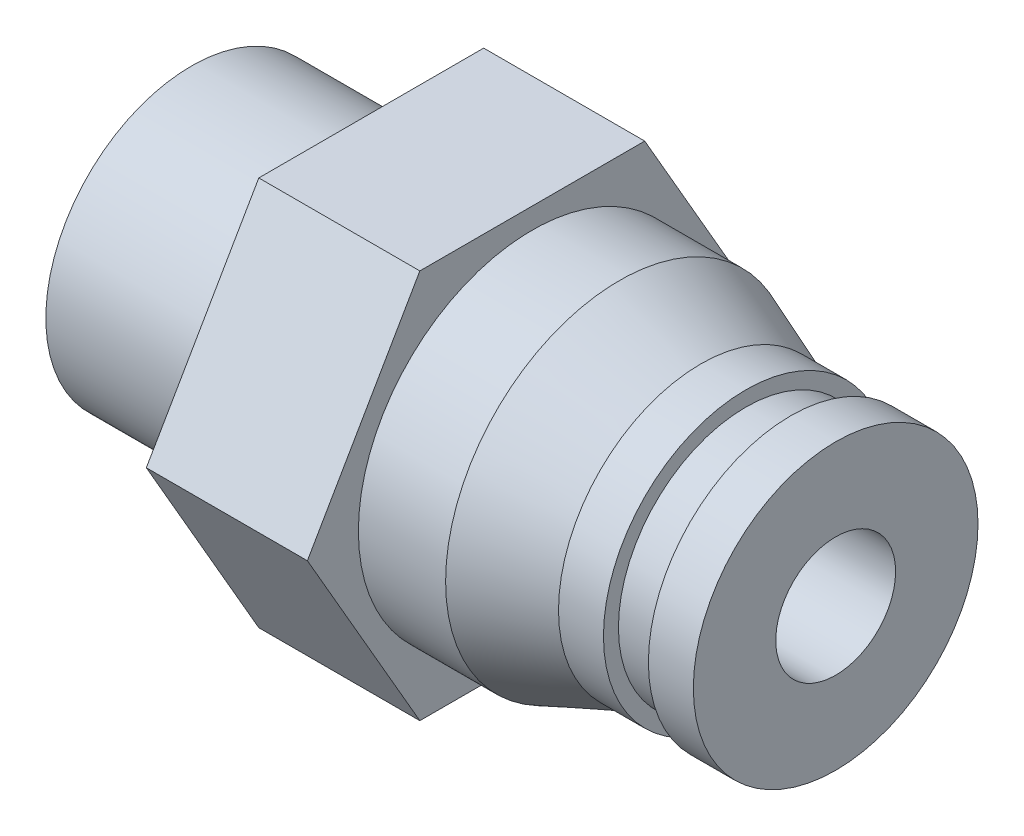
ISO-10303-21;
HEADER;
FILE_DESCRIPTION(('STEP AP214'),'2;1');
FILE_NAME('part.step','',(''),(''),'','','');
FILE_SCHEMA(('AUTOMOTIVE_DESIGN { 1 0 10303 214 1 1 1 1 }'));
ENDSEC;
DATA;
#1=APPLICATION_CONTEXT('core data for automotive mechanical design processes');
#2=APPLICATION_PROTOCOL_DEFINITION('international standard','automotive_design',2000,#1);
#3=PRODUCT_CONTEXT('',#1,'mechanical');
#4=PRODUCT('Part','Part','',(#3));
#5=PRODUCT_RELATED_PRODUCT_CATEGORY('part','',(#4));
#6=PRODUCT_DEFINITION_FORMATION('','',#4);
#7=PRODUCT_DEFINITION_CONTEXT('part definition',#1,'design');
#8=PRODUCT_DEFINITION('design','',#6,#7);
#9=PRODUCT_DEFINITION_SHAPE('','',#8);
#10=(LENGTH_UNIT() NAMED_UNIT(*) SI_UNIT(.MILLI.,.METRE.));
#11=(NAMED_UNIT(*) PLANE_ANGLE_UNIT() SI_UNIT($,.RADIAN.));
#12=(NAMED_UNIT(*) SI_UNIT($,.STERADIAN.) SOLID_ANGLE_UNIT());
#13=UNCERTAINTY_MEASURE_WITH_UNIT(LENGTH_MEASURE(1.E-05),#10,'distance_accuracy_value','');
#14=(GEOMETRIC_REPRESENTATION_CONTEXT(3) GLOBAL_UNCERTAINTY_ASSIGNED_CONTEXT((#13)) GLOBAL_UNIT_ASSIGNED_CONTEXT((#10,
#11,#12)) REPRESENTATION_CONTEXT('',''));
#15=CARTESIAN_POINT('',(0.,0.,0.));
#16=DIRECTION('',(0.,0.,1.));
#17=DIRECTION('',(1.,0.,0.));
#18=AXIS2_PLACEMENT_3D('',#15,#16,#17);
#19=CARTESIAN_POINT('',(6.,4.86,0.));
#20=DIRECTION('',(-1.,0.,0.));
#21=DIRECTION('',(0.,0.,1.));
#22=AXIS2_PLACEMENT_3D('',#19,#20,#21);
#23=PLANE('',#22);
#24=CARTESIAN_POINT('',(6.,0.,0.));
#25=DIRECTION('',(1.,0.,0.));
#26=DIRECTION('',(0.,0.,-1.));
#27=AXIS2_PLACEMENT_3D('',#24,#25,#26);
#28=CIRCLE('',#27,4.86);
#29=CARTESIAN_POINT('',(6.,0.,-4.86));
#30=VERTEX_POINT('',#29);
#31=EDGE_CURVE('E216',#30,#30,#28,.T.);
#32=ORIENTED_EDGE('',*,*,#31,.T.);
#33=EDGE_LOOP('',(#32));
#34=FACE_BOUND('',#33,.T.);
#35=DIRECTION('',(0.,-0.866025403784439,0.5));
#36=VECTOR('',#35,1.);
#37=CARTESIAN_POINT('',(6.,0.,-7.50555349946514));
#38=LINE('',#37,#36);
#39=CARTESIAN_POINT('',(6.,0.,-7.50555349946514));
#40=VERTEX_POINT('',#39);
#41=CARTESIAN_POINT('',(6.,-6.5,-3.75277674973257));
#42=VERTEX_POINT('',#41);
#43=EDGE_CURVE('E122',#40,#42,#38,.T.);
#44=ORIENTED_EDGE('',*,*,#43,.T.);
#45=DIRECTION('',(0.,0.,1.));
#46=VECTOR('',#45,1.);
#47=CARTESIAN_POINT('',(6.,-6.5,-3.75277674973257));
#48=LINE('',#47,#46);
#49=CARTESIAN_POINT('',(6.,-6.5,3.75277674973257));
#50=VERTEX_POINT('',#49);
#51=EDGE_CURVE('E107',#42,#50,#48,.T.);
#52=ORIENTED_EDGE('',*,*,#51,.T.);
#53=DIRECTION('',(0.,0.866025403784439,0.5));
#54=VECTOR('',#53,1.);
#55=CARTESIAN_POINT('',(6.,-6.5,3.75277674973257));
#56=LINE('',#55,#54);
#57=CARTESIAN_POINT('',(6.,0.,7.50555349946513));
#58=VERTEX_POINT('',#57);
#59=EDGE_CURVE('E116',#50,#58,#56,.T.);
#60=ORIENTED_EDGE('',*,*,#59,.T.);
#61=DIRECTION('',(0.,0.866025403784438,-0.5));
#62=VECTOR('',#61,1.);
#63=CARTESIAN_POINT('',(6.,0.,7.50555349946513));
#64=LINE('',#63,#62);
#65=CARTESIAN_POINT('',(6.,6.5,3.75277674973257));
#66=VERTEX_POINT('',#65);
#67=EDGE_CURVE('E31',#58,#66,#64,.T.);
#68=ORIENTED_EDGE('',*,*,#67,.T.);
#69=DIRECTION('',(0.,0.,-1.));
#70=VECTOR('',#69,1.);
#71=CARTESIAN_POINT('',(6.,6.5,3.75277674973257));
#72=LINE('',#71,#70);
#73=CARTESIAN_POINT('',(6.,6.5,-3.75277674973257));
#74=VERTEX_POINT('',#73);
#75=EDGE_CURVE('E126',#66,#74,#72,.T.);
#76=ORIENTED_EDGE('',*,*,#75,.T.);
#77=DIRECTION('',(0.,-0.866025403784439,-0.5));
#78=VECTOR('',#77,1.);
#79=CARTESIAN_POINT('',(6.,6.5,-3.75277674973257));
#80=LINE('',#79,#78);
#81=EDGE_CURVE('E129',#74,#40,#80,.T.);
#82=ORIENTED_EDGE('',*,*,#81,.T.);
#83=EDGE_LOOP('',(#44,#52,#60,#68,#76,#82));
#84=FACE_BOUND('',#83,.T.);
#85=ADVANCED_FACE('F16',(#34,#84),#23,.T.);
#86=CARTESIAN_POINT('',(11.375,8.5,0.));
#87=DIRECTION('',(1.,0.,0.));
#88=DIRECTION('',(0.,0.,-1.));
#89=AXIS2_PLACEMENT_3D('',#86,#87,#88);
#90=PLANE('',#89);
#91=CARTESIAN_POINT('',(11.375,0.,0.));
#92=DIRECTION('',(1.,0.,0.));
#93=DIRECTION('',(0.,0.,-1.));
#94=AXIS2_PLACEMENT_3D('',#91,#92,#93);
#95=CIRCLE('',#94,5.80412866912143);
#96=CARTESIAN_POINT('',(11.375,0.,-5.80412866912143));
#97=VERTEX_POINT('',#96);
#98=EDGE_CURVE('E213',#97,#97,#95,.T.);
#99=ORIENTED_EDGE('',*,*,#98,.F.);
#100=EDGE_LOOP('',(#99));
#101=FACE_BOUND('',#100,.T.);
#102=DIRECTION('',(0.,0.866025403784439,0.5));
#103=VECTOR('',#102,1.);
#104=CARTESIAN_POINT('',(11.375,-6.5,3.75277674973257));
#105=LINE('',#104,#103);
#106=CARTESIAN_POINT('',(11.375,-6.5,3.75277674973257));
#107=VERTEX_POINT('',#106);
#108=CARTESIAN_POINT('',(11.375,0.,7.50555349946513));
#109=VERTEX_POINT('',#108);
#110=EDGE_CURVE('E133',#107,#109,#105,.T.);
#111=ORIENTED_EDGE('',*,*,#110,.F.);
#112=DIRECTION('',(0.,0.,1.));
#113=VECTOR('',#112,1.);
#114=CARTESIAN_POINT('',(11.375,-6.5,-3.75277674973257));
#115=LINE('',#114,#113);
#116=CARTESIAN_POINT('',(11.375,-6.5,-3.75277674973257));
#117=VERTEX_POINT('',#116);
#118=EDGE_CURVE('E39',#117,#107,#115,.T.);
#119=ORIENTED_EDGE('',*,*,#118,.F.);
#120=DIRECTION('',(0.,-0.866025403784439,0.5));
#121=VECTOR('',#120,1.);
#122=CARTESIAN_POINT('',(11.375,0.,-7.50555349946514));
#123=LINE('',#122,#121);
#124=CARTESIAN_POINT('',(11.375,0.,-7.50555349946514));
#125=VERTEX_POINT('',#124);
#126=EDGE_CURVE('E113',#125,#117,#123,.T.);
#127=ORIENTED_EDGE('',*,*,#126,.F.);
#128=DIRECTION('',(0.,-0.866025403784439,-0.5));
#129=VECTOR('',#128,1.);
#130=CARTESIAN_POINT('',(11.375,6.5,-3.75277674973257));
#131=LINE('',#130,#129);
#132=CARTESIAN_POINT('',(11.375,6.5,-3.75277674973257));
#133=VERTEX_POINT('',#132);
#134=EDGE_CURVE('E141',#133,#125,#131,.T.);
#135=ORIENTED_EDGE('',*,*,#134,.F.);
#136=DIRECTION('',(0.,0.,-1.));
#137=VECTOR('',#136,1.);
#138=CARTESIAN_POINT('',(11.375,6.5,3.75277674973257));
#139=LINE('',#138,#137);
#140=CARTESIAN_POINT('',(11.375,6.5,3.75277674973257));
#141=VERTEX_POINT('',#140);
#142=EDGE_CURVE('E138',#141,#133,#139,.T.);
#143=ORIENTED_EDGE('',*,*,#142,.F.);
#144=DIRECTION('',(0.,0.866025403784438,-0.5));
#145=VECTOR('',#144,1.);
#146=CARTESIAN_POINT('',(11.375,0.,7.50555349946513));
#147=LINE('',#146,#145);
#148=EDGE_CURVE('E135',#109,#141,#147,.T.);
#149=ORIENTED_EDGE('',*,*,#148,.F.);
#150=EDGE_LOOP('',(#111,#119,#127,#135,#143,#149));
#151=FACE_BOUND('',#150,.T.);
#152=ADVANCED_FACE('F270',(#101,#151),#90,.T.);
#153=CARTESIAN_POINT('',(0.,0.,0.));
#154=DIRECTION('',(-1.,0.,0.));
#155=DIRECTION('',(0.,0.,1.));
#156=AXIS2_PLACEMENT_3D('',#153,#154,#155);
#157=PLANE('',#156);
#158=CARTESIAN_POINT('',(0.,0.,0.));
#159=DIRECTION('',(1.,0.,0.));
#160=DIRECTION('',(0.,0.,-1.));
#161=AXIS2_PLACEMENT_3D('',#158,#159,#160);
#162=CIRCLE('',#161,4.86);
#163=CARTESIAN_POINT('',(0.,0.,-4.86));
#164=VERTEX_POINT('',#163);
#165=EDGE_CURVE('E219',#164,#164,#162,.T.);
#166=ORIENTED_EDGE('',*,*,#165,.F.);
#167=EDGE_LOOP('',(#166));
#168=FACE_BOUND('',#167,.T.);
#169=DIRECTION('',(0.,-0.866025403784439,-0.5));
#170=VECTOR('',#169,1.);
#171=CARTESIAN_POINT('',(0.,0.,1.73205080756888));
#172=LINE('',#171,#170);
#173=CARTESIAN_POINT('',(0.,0.,1.73205080756888));
#174=VERTEX_POINT('',#173);
#175=CARTESIAN_POINT('',(0.,-1.5,0.866025403784438));
#176=VERTEX_POINT('',#175);
#177=EDGE_CURVE('E170',#174,#176,#172,.T.);
#178=ORIENTED_EDGE('',*,*,#177,.T.);
#179=DIRECTION('',(0.,0.,-1.));
#180=VECTOR('',#179,1.);
#181=CARTESIAN_POINT('',(0.,-1.5,0.866025403784438));
#182=LINE('',#181,#180);
#183=CARTESIAN_POINT('',(0.,-1.5,-0.866025403784439));
#184=VERTEX_POINT('',#183);
#185=EDGE_CURVE('E148',#176,#184,#182,.T.);
#186=ORIENTED_EDGE('',*,*,#185,.T.);
#187=DIRECTION('',(0.,0.866025403784439,-0.5));
#188=VECTOR('',#187,1.);
#189=CARTESIAN_POINT('',(0.,-1.5,-0.866025403784439));
#190=LINE('',#189,#188);
#191=CARTESIAN_POINT('',(0.,0.,-1.73205080756888));
#192=VERTEX_POINT('',#191);
#193=EDGE_CURVE('E158',#184,#192,#190,.T.);
#194=ORIENTED_EDGE('',*,*,#193,.T.);
#195=DIRECTION('',(0.,0.866025403784438,0.5));
#196=VECTOR('',#195,1.);
#197=CARTESIAN_POINT('',(0.,0.,-1.73205080756888));
#198=LINE('',#197,#196);
#199=CARTESIAN_POINT('',(0.,1.5,-0.866025403784439));
#200=VERTEX_POINT('',#199);
#201=EDGE_CURVE('E161',#192,#200,#198,.T.);
#202=ORIENTED_EDGE('',*,*,#201,.T.);
#203=DIRECTION('',(0.,0.,1.));
#204=VECTOR('',#203,1.);
#205=CARTESIAN_POINT('',(0.,1.5,-0.866025403784439));
#206=LINE('',#205,#204);
#207=CARTESIAN_POINT('',(0.,1.5,0.866025403784438));
#208=VERTEX_POINT('',#207);
#209=EDGE_CURVE('E164',#200,#208,#206,.T.);
#210=ORIENTED_EDGE('',*,*,#209,.T.);
#211=DIRECTION('',(0.,-0.866025403784439,0.5));
#212=VECTOR('',#211,1.);
#213=CARTESIAN_POINT('',(0.,1.5,0.866025403784438));
#214=LINE('',#213,#212);
#215=EDGE_CURVE('E167',#208,#174,#214,.T.);
#216=ORIENTED_EDGE('',*,*,#215,.T.);
#217=EDGE_LOOP('',(#178,#186,#194,#202,#210,#216));
#218=FACE_BOUND('',#217,.T.);
#219=ADVANCED_FACE('F18',(#168,#218),#157,.T.);
#220=CARTESIAN_POINT('',(5.5,2.,0.));
#221=DIRECTION('',(1.,0.,0.));
#222=DIRECTION('',(0.,0.,-1.));
#223=AXIS2_PLACEMENT_3D('',#220,#221,#222);
#224=PLANE('',#223);
#225=CARTESIAN_POINT('',(5.5,0.,0.));
#226=DIRECTION('',(1.,0.,0.));
#227=DIRECTION('',(0.,0.,-1.));
#228=AXIS2_PLACEMENT_3D('',#225,#226,#227);
#229=CIRCLE('',#228,2.);
#230=CARTESIAN_POINT('',(5.5,0.,-2.));
#231=VERTEX_POINT('',#230);
#232=EDGE_CURVE('E186',#231,#231,#229,.T.);
#233=ORIENTED_EDGE('',*,*,#232,.T.);
#234=EDGE_LOOP('',(#233));
#235=FACE_BOUND('',#234,.T.);
#236=DIRECTION('',(0.,-0.866025403784439,0.5));
#237=VECTOR('',#236,1.);
#238=CARTESIAN_POINT('',(5.5,0.75,-2.1650635094611));
#239=LINE('',#238,#237);
#240=CARTESIAN_POINT('',(5.5,0.,-1.73205080756888));
#241=VERTEX_POINT('',#240);
#242=CARTESIAN_POINT('',(5.5,-1.5,-0.866025403784439));
#243=VERTEX_POINT('',#242);
#244=EDGE_CURVE('E24',#241,#243,#239,.T.);
#245=ORIENTED_EDGE('',*,*,#244,.T.);
#246=DIRECTION('',(0.,0.,1.));
#247=VECTOR('',#246,1.);
#248=CARTESIAN_POINT('',(5.5,-1.5,0.));
#249=LINE('',#248,#247);
#250=CARTESIAN_POINT('',(5.5,-1.5,0.866025403784438));
#251=VERTEX_POINT('',#250);
#252=EDGE_CURVE('E11',#243,#251,#249,.T.);
#253=ORIENTED_EDGE('',*,*,#252,.T.);
#254=DIRECTION('',(0.,0.866025403784439,0.5));
#255=VECTOR('',#254,1.);
#256=CARTESIAN_POINT('',(5.5,0.75,2.1650635094611));
#257=LINE('',#256,#255);
#258=CARTESIAN_POINT('',(5.5,0.,1.73205080756888));
#259=VERTEX_POINT('',#258);
#260=EDGE_CURVE('E222',#251,#259,#257,.T.);
#261=ORIENTED_EDGE('',*,*,#260,.T.);
#262=DIRECTION('',(0.,0.866025403784439,-0.5));
#263=VECTOR('',#262,1.);
#264=CARTESIAN_POINT('',(5.5,2.25,0.433012701892219));
#265=LINE('',#264,#263);
#266=CARTESIAN_POINT('',(5.5,1.5,0.866025403784438));
#267=VERTEX_POINT('',#266);
#268=EDGE_CURVE('E225',#259,#267,#265,.T.);
#269=ORIENTED_EDGE('',*,*,#268,.T.);
#270=DIRECTION('',(0.,0.,-1.));
#271=VECTOR('',#270,1.);
#272=CARTESIAN_POINT('',(5.5,1.5,0.));
#273=LINE('',#272,#271);
#274=CARTESIAN_POINT('',(5.5,1.5,-0.866025403784439));
#275=VERTEX_POINT('',#274);
#276=EDGE_CURVE('E228',#267,#275,#273,.T.);
#277=ORIENTED_EDGE('',*,*,#276,.T.);
#278=DIRECTION('',(0.,-0.866025403784439,-0.5));
#279=VECTOR('',#278,1.);
#280=CARTESIAN_POINT('',(5.5,2.25,-0.433012701892219));
#281=LINE('',#280,#279);
#282=EDGE_CURVE('E231',#275,#241,#281,.T.);
#283=ORIENTED_EDGE('',*,*,#282,.T.);
#284=EDGE_LOOP('',(#245,#253,#261,#269,#277,#283));
#285=FACE_BOUND('',#284,.T.);
#286=ADVANCED_FACE('F235',(#235,#285),#224,.T.);
#287=CARTESIAN_POINT('',(0.,0.,0.));
#288=DIRECTION('',(1.,0.,0.));
#289=DIRECTION('',(0.,0.,-1.));
#290=AXIS2_PLACEMENT_3D('',#287,#288,#289);
#291=CYLINDRICAL_SURFACE('',#290,4.86);
#292=ORIENTED_EDGE('',*,*,#165,.T.);
#293=EDGE_LOOP('',(#292));
#294=FACE_BOUND('',#293,.T.);
#295=ORIENTED_EDGE('',*,*,#31,.F.);
#296=EDGE_LOOP('',(#295));
#297=FACE_BOUND('',#296,.T.);
#298=ADVANCED_FACE('F279',(#294,#297),#291,.T.);
#299=CARTESIAN_POINT('',(0.,0.,0.));
#300=DIRECTION('',(1.,0.,0.));
#301=DIRECTION('',(0.,0.,-1.));
#302=AXIS2_PLACEMENT_3D('',#299,#300,#301);
#303=CYLINDRICAL_SURFACE('',#302,5.80412866912143);
#304=ORIENTED_EDGE('',*,*,#98,.T.);
#305=EDGE_LOOP('',(#304));
#306=FACE_BOUND('',#305,.T.);
#307=CARTESIAN_POINT('',(14.2862722000945,0.,0.));
#308=DIRECTION('',(1.,0.,0.));
#309=DIRECTION('',(0.,0.,-1.));
#310=AXIS2_PLACEMENT_3D('',#307,#308,#309);
#311=CIRCLE('',#310,5.80412866912143);
#312=CARTESIAN_POINT('',(14.2862722000945,0.,-5.80412866912143));
#313=VERTEX_POINT('',#312);
#314=EDGE_CURVE('E210',#313,#313,#311,.T.);
#315=ORIENTED_EDGE('',*,*,#314,.F.);
#316=EDGE_LOOP('',(#315));
#317=FACE_BOUND('',#316,.T.);
#318=ADVANCED_FACE('F281',(#306,#317),#303,.T.);
#319=CARTESIAN_POINT('',(17.,0.,0.));
#320=DIRECTION('',(-1.,0.,0.));
#321=DIRECTION('',(0.,0.,1.));
#322=AXIS2_PLACEMENT_3D('',#319,#320,#321);
#323=CONICAL_SURFACE('',#322,4.75,0.370503949260783);
#324=ORIENTED_EDGE('',*,*,#314,.T.);
#325=EDGE_LOOP('',(#324));
#326=FACE_BOUND('',#325,.T.);
#327=CARTESIAN_POINT('',(17.,0.,0.));
#328=DIRECTION('',(1.,0.,0.));
#329=DIRECTION('',(0.,0.,-1.));
#330=AXIS2_PLACEMENT_3D('',#327,#328,#329);
#331=CIRCLE('',#330,4.75);
#332=CARTESIAN_POINT('',(17.,0.,-4.75));
#333=VERTEX_POINT('',#332);
#334=EDGE_CURVE('E207',#333,#333,#331,.T.);
#335=ORIENTED_EDGE('',*,*,#334,.F.);
#336=EDGE_LOOP('',(#335));
#337=FACE_BOUND('',#336,.T.);
#338=ADVANCED_FACE('F287',(#326,#337),#323,.T.);
#339=CARTESIAN_POINT('',(0.,0.,0.));
#340=DIRECTION('',(1.,0.,0.));
#341=DIRECTION('',(0.,0.,-1.));
#342=AXIS2_PLACEMENT_3D('',#339,#340,#341);
#343=CYLINDRICAL_SURFACE('',#342,4.75);
#344=ORIENTED_EDGE('',*,*,#334,.T.);
#345=EDGE_LOOP('',(#344));
#346=FACE_BOUND('',#345,.T.);
#347=CARTESIAN_POINT('',(18.5,0.,0.));
#348=DIRECTION('',(1.,0.,0.));
#349=DIRECTION('',(0.,0.,-1.));
#350=AXIS2_PLACEMENT_3D('',#347,#348,#349);
#351=CIRCLE('',#350,4.75);
#352=CARTESIAN_POINT('',(18.5,0.,-4.75));
#353=VERTEX_POINT('',#352);
#354=EDGE_CURVE('E204',#353,#353,#351,.T.);
#355=ORIENTED_EDGE('',*,*,#354,.F.);
#356=EDGE_LOOP('',(#355));
#357=FACE_BOUND('',#356,.T.);
#358=ADVANCED_FACE('F331',(#346,#357),#343,.T.);
#359=CARTESIAN_POINT('',(18.5,4.75,0.));
#360=DIRECTION('',(1.,0.,0.));
#361=DIRECTION('',(0.,0.,-1.));
#362=AXIS2_PLACEMENT_3D('',#359,#360,#361);
#363=PLANE('',#362);
#364=ORIENTED_EDGE('',*,*,#354,.T.);
#365=EDGE_LOOP('',(#364));
#366=FACE_BOUND('',#365,.T.);
#367=CARTESIAN_POINT('',(18.5,0.,0.));
#368=DIRECTION('',(1.,0.,0.));
#369=DIRECTION('',(0.,0.,-1.));
#370=AXIS2_PLACEMENT_3D('',#367,#368,#369);
#371=CIRCLE('',#370,4.25);
#372=CARTESIAN_POINT('',(18.5,0.,-4.25));
#373=VERTEX_POINT('',#372);
#374=EDGE_CURVE('E201',#373,#373,#371,.T.);
#375=ORIENTED_EDGE('',*,*,#374,.F.);
#376=EDGE_LOOP('',(#375));
#377=FACE_BOUND('',#376,.T.);
#378=ADVANCED_FACE('F341',(#366,#377),#363,.T.);
#379=CARTESIAN_POINT('',(0.,0.,0.));
#380=DIRECTION('',(1.,0.,0.));
#381=DIRECTION('',(0.,0.,-1.));
#382=AXIS2_PLACEMENT_3D('',#379,#380,#381);
#383=CYLINDRICAL_SURFACE('',#382,4.25);
#384=ORIENTED_EDGE('',*,*,#374,.T.);
#385=EDGE_LOOP('',(#384));
#386=FACE_BOUND('',#385,.T.);
#387=CARTESIAN_POINT('',(20.,0.,0.));
#388=DIRECTION('',(1.,0.,0.));
#389=DIRECTION('',(0.,0.,-1.));
#390=AXIS2_PLACEMENT_3D('',#387,#388,#389);
#391=CIRCLE('',#390,4.25);
#392=CARTESIAN_POINT('',(20.,0.,-4.25));
#393=VERTEX_POINT('',#392);
#394=EDGE_CURVE('E198',#393,#393,#391,.T.);
#395=ORIENTED_EDGE('',*,*,#394,.F.);
#396=EDGE_LOOP('',(#395));
#397=FACE_BOUND('',#396,.T.);
#398=ADVANCED_FACE('F351',(#386,#397),#383,.T.);
#399=CARTESIAN_POINT('',(20.,4.25,0.));
#400=DIRECTION('',(-1.,0.,0.));
#401=DIRECTION('',(0.,0.,1.));
#402=AXIS2_PLACEMENT_3D('',#399,#400,#401);
#403=PLANE('',#402);
#404=ORIENTED_EDGE('',*,*,#394,.T.);
#405=EDGE_LOOP('',(#404));
#406=FACE_BOUND('',#405,.T.);
#407=CARTESIAN_POINT('',(20.,0.,0.));
#408=DIRECTION('',(1.,0.,0.));
#409=DIRECTION('',(0.,0.,-1.));
#410=AXIS2_PLACEMENT_3D('',#407,#408,#409);
#411=CIRCLE('',#410,4.75);
#412=CARTESIAN_POINT('',(20.,0.,-4.75));
#413=VERTEX_POINT('',#412);
#414=EDGE_CURVE('E195',#413,#413,#411,.T.);
#415=ORIENTED_EDGE('',*,*,#414,.F.);
#416=EDGE_LOOP('',(#415));
#417=FACE_BOUND('',#416,.T.);
#418=ADVANCED_FACE('F361',(#406,#417),#403,.T.);
#419=CARTESIAN_POINT('',(0.,0.,0.));
#420=DIRECTION('',(1.,0.,0.));
#421=DIRECTION('',(0.,0.,-1.));
#422=AXIS2_PLACEMENT_3D('',#419,#420,#421);
#423=CYLINDRICAL_SURFACE('',#422,4.75);
#424=ORIENTED_EDGE('',*,*,#414,.T.);
#425=EDGE_LOOP('',(#424));
#426=FACE_BOUND('',#425,.T.);
#427=CARTESIAN_POINT('',(21.5,0.,0.));
#428=DIRECTION('',(1.,0.,0.));
#429=DIRECTION('',(0.,0.,-1.));
#430=AXIS2_PLACEMENT_3D('',#427,#428,#429);
#431=CIRCLE('',#430,4.75);
#432=CARTESIAN_POINT('',(21.5,0.,-4.75));
#433=VERTEX_POINT('',#432);
#434=EDGE_CURVE('E192',#433,#433,#431,.T.);
#435=ORIENTED_EDGE('',*,*,#434,.F.);
#436=EDGE_LOOP('',(#435));
#437=FACE_BOUND('',#436,.T.);
#438=ADVANCED_FACE('F371',(#426,#437),#423,.T.);
#439=CARTESIAN_POINT('',(21.5,4.75,0.));
#440=DIRECTION('',(1.,0.,0.));
#441=DIRECTION('',(0.,0.,-1.));
#442=AXIS2_PLACEMENT_3D('',#439,#440,#441);
#443=PLANE('',#442);
#444=ORIENTED_EDGE('',*,*,#434,.T.);
#445=EDGE_LOOP('',(#444));
#446=FACE_BOUND('',#445,.T.);
#447=CARTESIAN_POINT('',(21.5,0.,0.));
#448=DIRECTION('',(1.,0.,0.));
#449=DIRECTION('',(0.,0.,-1.));
#450=AXIS2_PLACEMENT_3D('',#447,#448,#449);
#451=CIRCLE('',#450,2.);
#452=CARTESIAN_POINT('',(21.5,0.,-2.));
#453=VERTEX_POINT('',#452);
#454=EDGE_CURVE('E189',#453,#453,#451,.T.);
#455=ORIENTED_EDGE('',*,*,#454,.F.);
#456=EDGE_LOOP('',(#455));
#457=FACE_BOUND('',#456,.T.);
#458=ADVANCED_FACE('F381',(#446,#457),#443,.T.);
#459=CARTESIAN_POINT('',(0.,0.,0.));
#460=DIRECTION('',(1.,0.,0.));
#461=DIRECTION('',(0.,0.,-1.));
#462=AXIS2_PLACEMENT_3D('',#459,#460,#461);
#463=CYLINDRICAL_SURFACE('',#462,2.);
#464=ORIENTED_EDGE('',*,*,#454,.T.);
#465=EDGE_LOOP('',(#464));
#466=FACE_BOUND('',#465,.T.);
#467=ORIENTED_EDGE('',*,*,#232,.F.);
#468=EDGE_LOOP('',(#467));
#469=FACE_BOUND('',#468,.T.);
#470=ADVANCED_FACE('F391',(#466,#469),#463,.F.);
#471=CARTESIAN_POINT('',(21.5,-1.5,0.866025403784438));
#472=DIRECTION('',(0.,1.,0.));
#473=DIRECTION('',(0.,0.,1.));
#474=AXIS2_PLACEMENT_3D('',#471,#472,#473);
#475=PLANE('',#474);
#476=DIRECTION('',(-1.,0.,0.));
#477=VECTOR('',#476,1.);
#478=CARTESIAN_POINT('',(21.5,-1.5,-0.866025403784439));
#479=LINE('',#478,#477);
#480=EDGE_CURVE('E184',#243,#184,#479,.T.);
#481=ORIENTED_EDGE('',*,*,#480,.T.);
#482=ORIENTED_EDGE('',*,*,#185,.F.);
#483=DIRECTION('',(-1.,0.,0.));
#484=VECTOR('',#483,1.);
#485=CARTESIAN_POINT('',(21.5,-1.5,0.866025403784438));
#486=LINE('',#485,#484);
#487=EDGE_CURVE('E173',#251,#176,#486,.T.);
#488=ORIENTED_EDGE('',*,*,#487,.F.);
#489=ORIENTED_EDGE('',*,*,#252,.F.);
#490=EDGE_LOOP('',(#481,#482,#488,#489));
#491=FACE_BOUND('',#490,.T.);
#492=ADVANCED_FACE('F250',(#491),#475,.T.);
#493=CARTESIAN_POINT('',(21.5,-1.5,-0.866025403784439));
#494=DIRECTION('',(0.,0.5,0.866025403784439));
#495=DIRECTION('',(0.,-0.866025403784439,0.5));
#496=AXIS2_PLACEMENT_3D('',#493,#494,#495);
#497=PLANE('',#496);
#498=DIRECTION('',(-1.,0.,0.));
#499=VECTOR('',#498,1.);
#500=CARTESIAN_POINT('',(21.5,0.,-1.73205080756888));
#501=LINE('',#500,#499);
#502=EDGE_CURVE('E182',#241,#192,#501,.T.);
#503=ORIENTED_EDGE('',*,*,#502,.T.);
#504=ORIENTED_EDGE('',*,*,#193,.F.);
#505=ORIENTED_EDGE('',*,*,#480,.F.);
#506=ORIENTED_EDGE('',*,*,#244,.F.);
#507=EDGE_LOOP('',(#503,#504,#505,#506));
#508=FACE_BOUND('',#507,.T.);
#509=ADVANCED_FACE('F239',(#508),#497,.T.);
#510=CARTESIAN_POINT('',(21.5,0.,-1.73205080756888));
#511=DIRECTION('',(0.,-0.5,0.866025403784439));
#512=DIRECTION('',(0.,-0.866025403784439,-0.5));
#513=AXIS2_PLACEMENT_3D('',#510,#511,#512);
#514=PLANE('',#513);
#515=DIRECTION('',(-1.,0.,0.));
#516=VECTOR('',#515,1.);
#517=CARTESIAN_POINT('',(21.5,1.5,-0.866025403784439));
#518=LINE('',#517,#516);
#519=EDGE_CURVE('E180',#275,#200,#518,.T.);
#520=ORIENTED_EDGE('',*,*,#519,.T.);
#521=ORIENTED_EDGE('',*,*,#201,.F.);
#522=ORIENTED_EDGE('',*,*,#502,.F.);
#523=ORIENTED_EDGE('',*,*,#282,.F.);
#524=EDGE_LOOP('',(#520,#521,#522,#523));
#525=FACE_BOUND('',#524,.T.);
#526=ADVANCED_FACE('F243',(#525),#514,.T.);
#527=CARTESIAN_POINT('',(21.5,1.5,-0.866025403784439));
#528=DIRECTION('',(0.,-1.,0.));
#529=DIRECTION('',(0.,0.,-1.));
#530=AXIS2_PLACEMENT_3D('',#527,#528,#529);
#531=PLANE('',#530);
#532=DIRECTION('',(-1.,0.,0.));
#533=VECTOR('',#532,1.);
#534=CARTESIAN_POINT('',(21.5,1.5,0.866025403784438));
#535=LINE('',#534,#533);
#536=EDGE_CURVE('E178',#267,#208,#535,.T.);
#537=ORIENTED_EDGE('',*,*,#536,.T.);
#538=ORIENTED_EDGE('',*,*,#209,.F.);
#539=ORIENTED_EDGE('',*,*,#519,.F.);
#540=ORIENTED_EDGE('',*,*,#276,.F.);
#541=EDGE_LOOP('',(#537,#538,#539,#540));
#542=FACE_BOUND('',#541,.T.);
#543=ADVANCED_FACE('F259',(#542),#531,.T.);
#544=CARTESIAN_POINT('',(21.5,1.5,0.866025403784438));
#545=DIRECTION('',(0.,-0.5,-0.866025403784439));
#546=DIRECTION('',(0.,0.866025403784439,-0.5));
#547=AXIS2_PLACEMENT_3D('',#544,#545,#546);
#548=PLANE('',#547);
#549=DIRECTION('',(-1.,0.,0.));
#550=VECTOR('',#549,1.);
#551=CARTESIAN_POINT('',(21.5,0.,1.73205080756888));
#552=LINE('',#551,#550);
#553=EDGE_CURVE('E176',#259,#174,#552,.T.);
#554=ORIENTED_EDGE('',*,*,#553,.T.);
#555=ORIENTED_EDGE('',*,*,#215,.F.);
#556=ORIENTED_EDGE('',*,*,#536,.F.);
#557=ORIENTED_EDGE('',*,*,#268,.F.);
#558=EDGE_LOOP('',(#554,#555,#556,#557));
#559=FACE_BOUND('',#558,.T.);
#560=ADVANCED_FACE('F256',(#559),#548,.T.);
#561=CARTESIAN_POINT('',(21.5,0.,1.73205080756888));
#562=DIRECTION('',(0.,0.5,-0.866025403784439));
#563=DIRECTION('',(0.,0.866025403784439,0.5));
#564=AXIS2_PLACEMENT_3D('',#561,#562,#563);
#565=PLANE('',#564);
#566=ORIENTED_EDGE('',*,*,#487,.T.);
#567=ORIENTED_EDGE('',*,*,#177,.F.);
#568=ORIENTED_EDGE('',*,*,#553,.F.);
#569=ORIENTED_EDGE('',*,*,#260,.F.);
#570=EDGE_LOOP('',(#566,#567,#568,#569));
#571=FACE_BOUND('',#570,.T.);
#572=ADVANCED_FACE('F252',(#571),#565,.T.);
#573=CARTESIAN_POINT('',(11.375,-6.5,-3.75277674973257));
#574=DIRECTION('',(0.,-1.,0.));
#575=DIRECTION('',(0.,0.,-1.));
#576=AXIS2_PLACEMENT_3D('',#573,#574,#575);
#577=PLANE('',#576);
#578=DIRECTION('',(-1.,0.,0.));
#579=VECTOR('',#578,1.);
#580=CARTESIAN_POINT('',(11.375,-6.5,-3.75277674973257));
#581=LINE('',#580,#579);
#582=EDGE_CURVE('E146',#117,#42,#581,.T.);
#583=ORIENTED_EDGE('',*,*,#582,.F.);
#584=ORIENTED_EDGE('',*,*,#118,.T.);
#585=DIRECTION('',(-1.,0.,0.));
#586=VECTOR('',#585,1.);
#587=CARTESIAN_POINT('',(11.375,-6.5,3.75277674973257));
#588=LINE('',#587,#586);
#589=EDGE_CURVE('E103',#107,#50,#588,.T.);
#590=ORIENTED_EDGE('',*,*,#589,.T.);
#591=ORIENTED_EDGE('',*,*,#51,.F.);
#592=EDGE_LOOP('',(#583,#584,#590,#591));
#593=FACE_BOUND('',#592,.T.);
#594=ADVANCED_FACE('F105',(#593),#577,.T.);
#595=CARTESIAN_POINT('',(11.375,0.,-7.50555349946514));
#596=DIRECTION('',(0.,-0.5,-0.866025403784439));
#597=DIRECTION('',(0.,0.866025403784439,-0.5));
#598=AXIS2_PLACEMENT_3D('',#595,#596,#597);
#599=PLANE('',#598);
#600=DIRECTION('',(-1.,0.,0.));
#601=VECTOR('',#600,1.);
#602=CARTESIAN_POINT('',(11.375,0.,-7.50555349946514));
#603=LINE('',#602,#601);
#604=EDGE_CURVE('E149',#125,#40,#603,.T.);
#605=ORIENTED_EDGE('',*,*,#604,.F.);
#606=ORIENTED_EDGE('',*,*,#126,.T.);
#607=ORIENTED_EDGE('',*,*,#582,.T.);
#608=ORIENTED_EDGE('',*,*,#43,.F.);
#609=EDGE_LOOP('',(#605,#606,#607,#608));
#610=FACE_BOUND('',#609,.T.);
#611=ADVANCED_FACE('F452',(#610),#599,.T.);
#612=CARTESIAN_POINT('',(11.375,6.5,-3.75277674973257));
#613=DIRECTION('',(0.,0.5,-0.866025403784439));
#614=DIRECTION('',(0.,0.866025403784439,0.5));
#615=AXIS2_PLACEMENT_3D('',#612,#613,#614);
#616=PLANE('',#615);
#617=DIRECTION('',(-1.,0.,0.));
#618=VECTOR('',#617,1.);
#619=CARTESIAN_POINT('',(11.375,6.5,-3.75277674973257));
#620=LINE('',#619,#618);
#621=EDGE_CURVE('E151',#133,#74,#620,.T.);
#622=ORIENTED_EDGE('',*,*,#621,.F.);
#623=ORIENTED_EDGE('',*,*,#134,.T.);
#624=ORIENTED_EDGE('',*,*,#604,.T.);
#625=ORIENTED_EDGE('',*,*,#81,.F.);
#626=EDGE_LOOP('',(#622,#623,#624,#625));
#627=FACE_BOUND('',#626,.T.);
#628=ADVANCED_FACE('F461',(#627),#616,.T.);
#629=CARTESIAN_POINT('',(11.375,6.5,3.75277674973257));
#630=DIRECTION('',(0.,1.,0.));
#631=DIRECTION('',(0.,0.,1.));
#632=AXIS2_PLACEMENT_3D('',#629,#630,#631);
#633=PLANE('',#632);
#634=DIRECTION('',(-1.,0.,0.));
#635=VECTOR('',#634,1.);
#636=CARTESIAN_POINT('',(11.375,6.5,3.75277674973257));
#637=LINE('',#636,#635);
#638=EDGE_CURVE('E153',#141,#66,#637,.T.);
#639=ORIENTED_EDGE('',*,*,#638,.F.);
#640=ORIENTED_EDGE('',*,*,#142,.T.);
#641=ORIENTED_EDGE('',*,*,#621,.T.);
#642=ORIENTED_EDGE('',*,*,#75,.F.);
#643=EDGE_LOOP('',(#639,#640,#641,#642));
#644=FACE_BOUND('',#643,.T.);
#645=ADVANCED_FACE('F471',(#644),#633,.T.);
#646=CARTESIAN_POINT('',(11.375,0.,7.50555349946513));
#647=DIRECTION('',(0.,0.5,0.866025403784438));
#648=DIRECTION('',(0.,-0.866025403784439,0.5));
#649=AXIS2_PLACEMENT_3D('',#646,#647,#648);
#650=PLANE('',#649);
#651=DIRECTION('',(-1.,0.,0.));
#652=VECTOR('',#651,1.);
#653=CARTESIAN_POINT('',(11.375,0.,7.50555349946513));
#654=LINE('',#653,#652);
#655=EDGE_CURVE('E112',#109,#58,#654,.T.);
#656=ORIENTED_EDGE('',*,*,#655,.F.);
#657=ORIENTED_EDGE('',*,*,#148,.T.);
#658=ORIENTED_EDGE('',*,*,#638,.T.);
#659=ORIENTED_EDGE('',*,*,#67,.F.);
#660=EDGE_LOOP('',(#656,#657,#658,#659));
#661=FACE_BOUND('',#660,.T.);
#662=ADVANCED_FACE('F481',(#661),#650,.T.);
#663=CARTESIAN_POINT('',(11.375,-6.5,3.75277674973257));
#664=DIRECTION('',(0.,-0.5,0.866025403784439));
#665=DIRECTION('',(0.,-0.866025403784439,-0.5));
#666=AXIS2_PLACEMENT_3D('',#663,#664,#665);
#667=PLANE('',#666);
#668=ORIENTED_EDGE('',*,*,#589,.F.);
#669=ORIENTED_EDGE('',*,*,#110,.T.);
#670=ORIENTED_EDGE('',*,*,#655,.T.);
#671=ORIENTED_EDGE('',*,*,#59,.F.);
#672=EDGE_LOOP('',(#668,#669,#670,#671));
#673=FACE_BOUND('',#672,.T.);
#674=ADVANCED_FACE('F117',(#673),#667,.T.);
#675=CLOSED_SHELL('',(#85,#152,#219,#286,#298,#318,#338,#358,#378,#398,#418,#438,#458,#470,#492,
#509,#526,#543,#560,#572,#594,#611,#628,#645,#662,#674));
#676=MANIFOLD_SOLID_BREP('B1',#675);
#677=ADVANCED_BREP_SHAPE_REPRESENTATION('',(#18,#676),#14);
#678=SHAPE_DEFINITION_REPRESENTATION(#9,#677);
ENDSEC;
END-ISO-10303-21;
